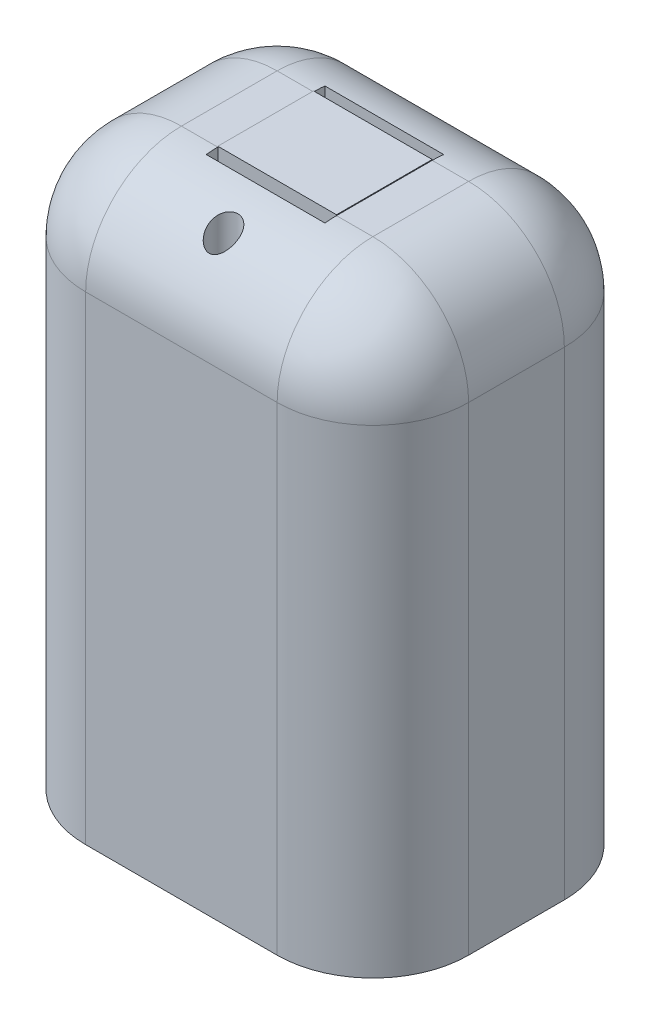
ISO-10303-21;
HEADER;
FILE_DESCRIPTION(('STEP AP214'),'2;1');
FILE_NAME('part.step','',(''),(''),'','','');
FILE_SCHEMA(('AUTOMOTIVE_DESIGN { 1 0 10303 214 1 1 1 1 }'));
ENDSEC;
DATA;
#1=APPLICATION_CONTEXT('core data for automotive mechanical design processes');
#2=APPLICATION_PROTOCOL_DEFINITION('international standard','automotive_design',2000,#1);
#3=PRODUCT_CONTEXT('',#1,'mechanical');
#4=PRODUCT('Part','Part','',(#3));
#5=PRODUCT_RELATED_PRODUCT_CATEGORY('part','',(#4));
#6=PRODUCT_DEFINITION_FORMATION('','',#4);
#7=PRODUCT_DEFINITION_CONTEXT('part definition',#1,'design');
#8=PRODUCT_DEFINITION('design','',#6,#7);
#9=PRODUCT_DEFINITION_SHAPE('','',#8);
#10=(LENGTH_UNIT() NAMED_UNIT(*) SI_UNIT(.MILLI.,.METRE.));
#11=(NAMED_UNIT(*) PLANE_ANGLE_UNIT() SI_UNIT($,.RADIAN.));
#12=(NAMED_UNIT(*) SI_UNIT($,.STERADIAN.) SOLID_ANGLE_UNIT());
#13=UNCERTAINTY_MEASURE_WITH_UNIT(LENGTH_MEASURE(1.E-05),#10,'distance_accuracy_value','');
#14=(GEOMETRIC_REPRESENTATION_CONTEXT(3) GLOBAL_UNCERTAINTY_ASSIGNED_CONTEXT((#13)) GLOBAL_UNIT_ASSIGNED_CONTEXT((#10,
#11,#12)) REPRESENTATION_CONTEXT('',''));
#15=CARTESIAN_POINT('',(0.,0.,0.));
#16=DIRECTION('',(0.,0.,1.));
#17=DIRECTION('',(1.,0.,0.));
#18=AXIS2_PLACEMENT_3D('',#15,#16,#17);
#19=CARTESIAN_POINT('',(-33.1654955272789,108.658164147272,4.4));
#20=DIRECTION('',(1.,0.,0.));
#21=DIRECTION('',(0.,0.,-1.));
#22=AXIS2_PLACEMENT_3D('',#19,#20,#21);
#23=PLANE('',#22);
#24=DIRECTION('',(0.,-1.,0.));
#25=VECTOR('',#24,1.);
#26=CARTESIAN_POINT('',(-33.1654955272789,135.449726458498,10.));
#27=LINE('',#26,#25);
#28=CARTESIAN_POINT('',(-33.1654955272789,135.408164147272,10.));
#29=VERTEX_POINT('',#28);
#30=CARTESIAN_POINT('',(-33.1654955272789,134.449726458498,10.));
#31=VERTEX_POINT('',#30);
#32=EDGE_CURVE('E56',#29,#31,#27,.T.);
#33=ORIENTED_EDGE('',*,*,#32,.T.);
#34=DIRECTION('',(0.,0.,-1.));
#35=VECTOR('',#34,1.);
#36=CARTESIAN_POINT('',(-33.1654955272789,134.449726458498,10.));
#37=LINE('',#36,#35);
#38=CARTESIAN_POINT('',(-33.1654955272789,134.449726458498,5.));
#39=VERTEX_POINT('',#38);
#40=EDGE_CURVE('E175',#31,#39,#37,.T.);
#41=ORIENTED_EDGE('',*,*,#40,.T.);
#42=DIRECTION('',(0.,1.,0.));
#43=VECTOR('',#42,1.);
#44=CARTESIAN_POINT('',(-33.1654955272789,135.449726458498,5.));
#45=LINE('',#44,#43);
#46=CARTESIAN_POINT('',(-33.1654955272789,135.408164147272,5.));
#47=VERTEX_POINT('',#46);
#48=EDGE_CURVE('E179',#39,#47,#45,.T.);
#49=ORIENTED_EDGE('',*,*,#48,.T.);
#50=CARTESIAN_POINT('',(-33.1654955272789,130.408164147272,5.));
#51=DIRECTION('',(1.,0.,0.));
#52=DIRECTION('',(0.,0.,-1.));
#53=AXIS2_PLACEMENT_3D('',#50,#51,#52);
#54=CIRCLE('',#53,5.);
#55=CARTESIAN_POINT('',(-33.1654955272789,135.372033605669,4.4));
#56=VERTEX_POINT('',#55);
#57=EDGE_CURVE('E345',#47,#56,#54,.F.);
#58=ORIENTED_EDGE('',*,*,#57,.T.);
#59=DIRECTION('',(0.,-1.,0.));
#60=VECTOR('',#59,1.);
#61=CARTESIAN_POINT('',(-33.1654955272789,108.658164147272,4.4));
#62=LINE('',#61,#60);
#63=CARTESIAN_POINT('',(-33.1654955272789,105.408164147272,4.4));
#64=VERTEX_POINT('',#63);
#65=EDGE_CURVE('E244',#56,#64,#62,.T.);
#66=ORIENTED_EDGE('',*,*,#65,.T.);
#67=DIRECTION('',(0.,0.,1.));
#68=VECTOR('',#67,1.);
#69=CARTESIAN_POINT('',(-33.1654955272789,105.408164147272,4.4));
#70=LINE('',#69,#68);
#71=CARTESIAN_POINT('',(-33.1654955272789,105.408164147272,10.6));
#72=VERTEX_POINT('',#71);
#73=EDGE_CURVE('E231',#64,#72,#70,.T.);
#74=ORIENTED_EDGE('',*,*,#73,.T.);
#75=DIRECTION('',(0.,-1.,0.));
#76=VECTOR('',#75,1.);
#77=CARTESIAN_POINT('',(-33.1654955272789,108.658164147272,10.6));
#78=LINE('',#77,#76);
#79=CARTESIAN_POINT('',(-33.1654955272789,135.372033605669,10.6));
#80=VERTEX_POINT('',#79);
#81=EDGE_CURVE('E243',#80,#72,#78,.T.);
#82=ORIENTED_EDGE('',*,*,#81,.F.);
#83=CARTESIAN_POINT('',(-33.1654955272789,130.408164147272,10.));
#84=DIRECTION('',(1.,0.,0.));
#85=DIRECTION('',(0.,0.,-1.));
#86=AXIS2_PLACEMENT_3D('',#83,#84,#85);
#87=CIRCLE('',#86,5.);
#88=EDGE_CURVE('E222',#80,#29,#87,.F.);
#89=ORIENTED_EDGE('',*,*,#88,.T.);
#90=EDGE_LOOP('',(#33,#41,#49,#58,#66,#74,#82,#89));
#91=FACE_BOUND('',#90,.T.);
#92=ADVANCED_FACE('F35',(#91),#23,.F.);
#93=CARTESIAN_POINT('',(-39.3654955272789,108.658164147272,4.4));
#94=DIRECTION('',(-1.,0.,0.));
#95=DIRECTION('',(0.,0.,1.));
#96=AXIS2_PLACEMENT_3D('',#93,#94,#95);
#97=PLANE('',#96);
#98=DIRECTION('',(0.,-1.,0.));
#99=VECTOR('',#98,1.);
#100=CARTESIAN_POINT('',(-39.3654955272789,135.449726458498,10.));
#101=LINE('',#100,#99);
#102=CARTESIAN_POINT('',(-39.3654955272789,135.408164147272,10.));
#103=VERTEX_POINT('',#102);
#104=CARTESIAN_POINT('',(-39.3654955272789,134.449726458498,10.));
#105=VERTEX_POINT('',#104);
#106=EDGE_CURVE('E207',#103,#105,#101,.T.);
#107=ORIENTED_EDGE('',*,*,#106,.F.);
#108=CARTESIAN_POINT('',(-39.3654955272789,130.408164147272,10.));
#109=DIRECTION('',(-1.,0.,0.));
#110=DIRECTION('',(0.,0.,1.));
#111=AXIS2_PLACEMENT_3D('',#108,#109,#110);
#112=CIRCLE('',#111,5.);
#113=CARTESIAN_POINT('',(-39.3654955272789,135.372033605669,10.6));
#114=VERTEX_POINT('',#113);
#115=EDGE_CURVE('E227',#103,#114,#112,.F.);
#116=ORIENTED_EDGE('',*,*,#115,.T.);
#117=DIRECTION('',(0.,-1.,0.));
#118=VECTOR('',#117,1.);
#119=CARTESIAN_POINT('',(-39.3654955272789,108.658164147272,10.6));
#120=LINE('',#119,#118);
#121=CARTESIAN_POINT('',(-39.3654955272789,105.408164147272,10.6));
#122=VERTEX_POINT('',#121);
#123=EDGE_CURVE('E249',#114,#122,#120,.T.);
#124=ORIENTED_EDGE('',*,*,#123,.T.);
#125=DIRECTION('',(0.,0.,-1.));
#126=VECTOR('',#125,1.);
#127=CARTESIAN_POINT('',(-39.3654955272789,105.408164147272,4.4));
#128=LINE('',#127,#126);
#129=CARTESIAN_POINT('',(-39.3654955272789,105.408164147272,4.4));
#130=VERTEX_POINT('',#129);
#131=EDGE_CURVE('E237',#122,#130,#128,.T.);
#132=ORIENTED_EDGE('',*,*,#131,.T.);
#133=DIRECTION('',(0.,-1.,0.));
#134=VECTOR('',#133,1.);
#135=CARTESIAN_POINT('',(-39.3654955272789,108.658164147272,4.4));
#136=LINE('',#135,#134);
#137=CARTESIAN_POINT('',(-39.3654955272789,135.372033605669,4.4));
#138=VERTEX_POINT('',#137);
#139=EDGE_CURVE('E247',#138,#130,#136,.T.);
#140=ORIENTED_EDGE('',*,*,#139,.F.);
#141=CARTESIAN_POINT('',(-39.3654955272789,130.408164147272,5.));
#142=DIRECTION('',(-1.,0.,0.));
#143=DIRECTION('',(0.,0.,1.));
#144=AXIS2_PLACEMENT_3D('',#141,#142,#143);
#145=CIRCLE('',#144,5.);
#146=CARTESIAN_POINT('',(-39.3654955272789,135.408164147272,5.));
#147=VERTEX_POINT('',#146);
#148=EDGE_CURVE('E49',#138,#147,#145,.F.);
#149=ORIENTED_EDGE('',*,*,#148,.T.);
#150=DIRECTION('',(0.,1.,0.));
#151=VECTOR('',#150,1.);
#152=CARTESIAN_POINT('',(-39.3654955272789,135.449726458498,5.));
#153=LINE('',#152,#151);
#154=CARTESIAN_POINT('',(-39.3654955272789,134.449726458498,5.));
#155=VERTEX_POINT('',#154);
#156=EDGE_CURVE('E210',#155,#147,#153,.T.);
#157=ORIENTED_EDGE('',*,*,#156,.F.);
#158=DIRECTION('',(0.,0.,-1.));
#159=VECTOR('',#158,1.);
#160=CARTESIAN_POINT('',(-39.3654955272789,134.449726458498,10.));
#161=LINE('',#160,#159);
#162=EDGE_CURVE('E64',#105,#155,#161,.T.);
#163=ORIENTED_EDGE('',*,*,#162,.F.);
#164=EDGE_LOOP('',(#107,#116,#124,#132,#140,#149,#157,#163));
#165=FACE_BOUND('',#164,.T.);
#166=ADVANCED_FACE('F350',(#165),#97,.F.);
#167=CARTESIAN_POINT('',(-46.2654955272789,135.408164147272,15.));
#168=DIRECTION('',(0.,-1.,0.));
#169=DIRECTION('',(0.,0.,-1.));
#170=AXIS2_PLACEMENT_3D('',#167,#168,#169);
#171=PLANE('',#170);
#172=DIRECTION('',(-1.,0.,0.));
#173=VECTOR('',#172,1.);
#174=CARTESIAN_POINT('',(-26.2654955272789,135.408164147272,10.));
#175=LINE('',#174,#173);
#176=CARTESIAN_POINT('',(-41.2654955272789,135.408164147272,10.));
#177=VERTEX_POINT('',#176);
#178=EDGE_CURVE('E271',#177,#103,#175,.F.);
#179=ORIENTED_EDGE('',*,*,#178,.T.);
#180=DIRECTION('',(0.,0.,-1.));
#181=VECTOR('',#180,1.);
#182=CARTESIAN_POINT('',(-39.3654955272789,135.408164147272,15.));
#183=LINE('',#182,#181);
#184=EDGE_CURVE('E224',#103,#147,#183,.T.);
#185=ORIENTED_EDGE('',*,*,#184,.T.);
#186=DIRECTION('',(-1.,0.,0.));
#187=VECTOR('',#186,1.);
#188=CARTESIAN_POINT('',(-46.2654955272789,135.408164147272,5.));
#189=LINE('',#188,#187);
#190=CARTESIAN_POINT('',(-41.2654955272789,135.408164147272,5.));
#191=VERTEX_POINT('',#190);
#192=EDGE_CURVE('E264',#147,#191,#189,.T.);
#193=ORIENTED_EDGE('',*,*,#192,.T.);
#194=DIRECTION('',(0.,0.,-1.));
#195=VECTOR('',#194,1.);
#196=CARTESIAN_POINT('',(-41.2654955272789,135.408164147272,15.));
#197=LINE('',#196,#195);
#198=EDGE_CURVE('E268',#191,#177,#197,.F.);
#199=ORIENTED_EDGE('',*,*,#198,.T.);
#200=EDGE_LOOP('',(#179,#185,#193,#199));
#201=FACE_BOUND('',#200,.T.);
#202=ADVANCED_FACE('F391',(#201),#171,.F.);
#203=CARTESIAN_POINT('',(-26.2654955272789,135.408164147272,15.));
#204=DIRECTION('',(-1.,0.,0.));
#205=DIRECTION('',(0.,-1.,0.));
#206=AXIS2_PLACEMENT_3D('',#203,#204,#205);
#207=PLANE('',#206);
#208=DIRECTION('',(0.,0.,-1.));
#209=VECTOR('',#208,1.);
#210=CARTESIAN_POINT('',(-26.2654955272789,105.408164147272,15.));
#211=LINE('',#210,#209);
#212=CARTESIAN_POINT('',(-26.2654955272789,105.408164147272,10.));
#213=VERTEX_POINT('',#212);
#214=CARTESIAN_POINT('',(-26.2654955272789,105.408164147272,5.));
#215=VERTEX_POINT('',#214);
#216=EDGE_CURVE('E256',#213,#215,#211,.T.);
#217=ORIENTED_EDGE('',*,*,#216,.T.);
#218=DIRECTION('',(0.,1.,0.));
#219=VECTOR('',#218,1.);
#220=CARTESIAN_POINT('',(-26.2654955272789,135.408164147272,5.));
#221=LINE('',#220,#219);
#222=CARTESIAN_POINT('',(-26.2654955272789,130.408164147272,5.));
#223=VERTEX_POINT('',#222);
#224=EDGE_CURVE('E282',#215,#223,#221,.T.);
#225=ORIENTED_EDGE('',*,*,#224,.T.);
#226=DIRECTION('',(0.,0.,-1.));
#227=VECTOR('',#226,1.);
#228=CARTESIAN_POINT('',(-26.2654955272789,130.408164147272,15.));
#229=LINE('',#228,#227);
#230=CARTESIAN_POINT('',(-26.2654955272789,130.408164147272,10.));
#231=VERTEX_POINT('',#230);
#232=EDGE_CURVE('E279',#223,#231,#229,.F.);
#233=ORIENTED_EDGE('',*,*,#232,.T.);
#234=DIRECTION('',(0.,1.,0.));
#235=VECTOR('',#234,1.);
#236=CARTESIAN_POINT('',(-26.2654955272789,105.408164147272,10.));
#237=LINE('',#236,#235);
#238=EDGE_CURVE('E277',#231,#213,#237,.F.);
#239=ORIENTED_EDGE('',*,*,#238,.T.);
#240=EDGE_LOOP('',(#217,#225,#233,#239));
#241=FACE_BOUND('',#240,.T.);
#242=ADVANCED_FACE('F465',(#241),#207,.F.);
#243=CARTESIAN_POINT('',(-31.2654955272789,135.408164147272,5.));
#244=VERTEX_POINT('',#243);
#245=EDGE_CURVE('E265',#244,#47,#189,.T.);
#246=ORIENTED_EDGE('',*,*,#245,.T.);
#247=DIRECTION('',(0.,0.,1.));
#248=VECTOR('',#247,1.);
#249=CARTESIAN_POINT('',(-33.1654955272789,135.408164147272,15.));
#250=LINE('',#249,#248);
#251=EDGE_CURVE('E219',#47,#29,#250,.T.);
#252=ORIENTED_EDGE('',*,*,#251,.T.);
#253=CARTESIAN_POINT('',(-31.2654955272789,135.408164147272,10.));
#254=VERTEX_POINT('',#253);
#255=EDGE_CURVE('E270',#29,#254,#175,.F.);
#256=ORIENTED_EDGE('',*,*,#255,.T.);
#257=DIRECTION('',(0.,0.,-1.));
#258=VECTOR('',#257,1.);
#259=CARTESIAN_POINT('',(-31.2654955272789,135.408164147272,15.));
#260=LINE('',#259,#258);
#261=EDGE_CURVE('E274',#254,#244,#260,.T.);
#262=ORIENTED_EDGE('',*,*,#261,.T.);
#263=EDGE_LOOP('',(#246,#252,#256,#262));
#264=FACE_BOUND('',#263,.T.);
#265=ADVANCED_FACE('F369',(#264),#171,.F.);
#266=CARTESIAN_POINT('',(-46.2654955272789,135.408164147272,15.));
#267=DIRECTION('',(1.,0.,0.));
#268=DIRECTION('',(0.,0.,-1.));
#269=AXIS2_PLACEMENT_3D('',#266,#267,#268);
#270=PLANE('',#269);
#271=DIRECTION('',(0.,0.,-1.));
#272=VECTOR('',#271,1.);
#273=CARTESIAN_POINT('',(-46.2654955272789,130.408164147272,15.));
#274=LINE('',#273,#272);
#275=CARTESIAN_POINT('',(-46.2654955272789,130.408164147272,10.));
#276=VERTEX_POINT('',#275);
#277=CARTESIAN_POINT('',(-46.2654955272789,130.408164147272,5.));
#278=VERTEX_POINT('',#277);
#279=EDGE_CURVE('E292',#276,#278,#274,.T.);
#280=ORIENTED_EDGE('',*,*,#279,.T.);
#281=DIRECTION('',(0.,-1.,0.));
#282=VECTOR('',#281,1.);
#283=CARTESIAN_POINT('',(-46.2654955272789,135.408164147272,5.));
#284=LINE('',#283,#282);
#285=CARTESIAN_POINT('',(-46.2654955272789,105.408164147272,5.));
#286=VERTEX_POINT('',#285);
#287=EDGE_CURVE('E294',#278,#286,#284,.T.);
#288=ORIENTED_EDGE('',*,*,#287,.T.);
#289=DIRECTION('',(0.,0.,-1.));
#290=VECTOR('',#289,1.);
#291=CARTESIAN_POINT('',(-46.2654955272789,105.408164147272,15.));
#292=LINE('',#291,#290);
#293=CARTESIAN_POINT('',(-46.2654955272789,105.408164147272,10.));
#294=VERTEX_POINT('',#293);
#295=EDGE_CURVE('E261',#294,#286,#292,.T.);
#296=ORIENTED_EDGE('',*,*,#295,.F.);
#297=DIRECTION('',(0.,-1.,0.));
#298=VECTOR('',#297,1.);
#299=CARTESIAN_POINT('',(-46.2654955272789,135.408164147272,10.));
#300=LINE('',#299,#298);
#301=EDGE_CURVE('E290',#294,#276,#300,.F.);
#302=ORIENTED_EDGE('',*,*,#301,.T.);
#303=EDGE_LOOP('',(#280,#288,#296,#302));
#304=FACE_BOUND('',#303,.T.);
#305=ADVANCED_FACE('F458',(#304),#270,.F.);
#306=CARTESIAN_POINT('',(-46.2654955272789,105.408164147272,15.));
#307=DIRECTION('',(0.,1.,0.));
#308=DIRECTION('',(0.,0.,1.));
#309=AXIS2_PLACEMENT_3D('',#306,#307,#308);
#310=PLANE('',#309);
#311=CARTESIAN_POINT('',(-36.2654955272789,105.408164147272,12.8));
#312=DIRECTION('',(0.,-1.,0.));
#313=DIRECTION('',(0.,0.,-1.));
#314=AXIS2_PLACEMENT_3D('',#311,#312,#313);
#315=CIRCLE('',#314,0.749999999999999);
#316=CARTESIAN_POINT('',(-36.2654955272789,105.408164147272,12.05));
#317=VERTEX_POINT('',#316);
#318=EDGE_CURVE('E382',#317,#317,#315,.T.);
#319=ORIENTED_EDGE('',*,*,#318,.F.);
#320=EDGE_LOOP('',(#319));
#321=FACE_BOUND('',#320,.T.);
#322=DIRECTION('',(-1.,0.,0.));
#323=VECTOR('',#322,1.);
#324=CARTESIAN_POINT('',(-39.3654955272789,105.408164147272,10.6));
#325=LINE('',#324,#323);
#326=EDGE_CURVE('E233',#72,#122,#325,.T.);
#327=ORIENTED_EDGE('',*,*,#326,.F.);
#328=ORIENTED_EDGE('',*,*,#73,.F.);
#329=DIRECTION('',(1.,0.,0.));
#330=VECTOR('',#329,1.);
#331=CARTESIAN_POINT('',(-39.3654955272789,105.408164147272,4.4));
#332=LINE('',#331,#330);
#333=EDGE_CURVE('E240',#130,#64,#332,.T.);
#334=ORIENTED_EDGE('',*,*,#333,.F.);
#335=ORIENTED_EDGE('',*,*,#131,.F.);
#336=EDGE_LOOP('',(#327,#328,#334,#335));
#337=FACE_BOUND('',#336,.T.);
#338=ORIENTED_EDGE('',*,*,#295,.T.);
#339=CARTESIAN_POINT('',(-41.2654955272789,105.408164147272,5.));
#340=DIRECTION('',(0.,1.,0.));
#341=DIRECTION('',(0.,0.,1.));
#342=AXIS2_PLACEMENT_3D('',#339,#340,#341);
#343=CIRCLE('',#342,5.);
#344=CARTESIAN_POINT('',(-41.2654955272789,105.408164147272,0.));
#345=VERTEX_POINT('',#344);
#346=EDGE_CURVE('E308',#286,#345,#343,.F.);
#347=ORIENTED_EDGE('',*,*,#346,.T.);
#348=DIRECTION('',(1.,0.,0.));
#349=VECTOR('',#348,1.);
#350=CARTESIAN_POINT('',(-46.2654955272789,105.408164147272,0.));
#351=LINE('',#350,#349);
#352=CARTESIAN_POINT('',(-31.2654955272789,105.408164147272,0.));
#353=VERTEX_POINT('',#352);
#354=EDGE_CURVE('E246',#345,#353,#351,.T.);
#355=ORIENTED_EDGE('',*,*,#354,.T.);
#356=CARTESIAN_POINT('',(-31.2654955272789,105.408164147272,5.));
#357=DIRECTION('',(0.,1.,0.));
#358=DIRECTION('',(0.,0.,1.));
#359=AXIS2_PLACEMENT_3D('',#356,#357,#358);
#360=CIRCLE('',#359,5.);
#361=EDGE_CURVE('E304',#353,#215,#360,.F.);
#362=ORIENTED_EDGE('',*,*,#361,.T.);
#363=ORIENTED_EDGE('',*,*,#216,.F.);
#364=CARTESIAN_POINT('',(-31.2654955272789,105.408164147272,10.));
#365=DIRECTION('',(0.,1.,0.));
#366=DIRECTION('',(0.,0.,1.));
#367=AXIS2_PLACEMENT_3D('',#364,#365,#366);
#368=CIRCLE('',#367,5.);
#369=CARTESIAN_POINT('',(-31.2654955272789,105.408164147272,15.));
#370=VERTEX_POINT('',#369);
#371=EDGE_CURVE('E302',#213,#370,#368,.F.);
#372=ORIENTED_EDGE('',*,*,#371,.T.);
#373=DIRECTION('',(1.,0.,0.));
#374=VECTOR('',#373,1.);
#375=CARTESIAN_POINT('',(-46.2654955272789,105.408164147272,15.));
#376=LINE('',#375,#374);
#377=CARTESIAN_POINT('',(-41.2654955272789,105.408164147272,15.));
#378=VERTEX_POINT('',#377);
#379=EDGE_CURVE('E253',#378,#370,#376,.T.);
#380=ORIENTED_EDGE('',*,*,#379,.F.);
#381=CARTESIAN_POINT('',(-41.2654955272789,105.408164147272,10.));
#382=DIRECTION('',(0.,1.,0.));
#383=DIRECTION('',(0.,0.,1.));
#384=AXIS2_PLACEMENT_3D('',#381,#382,#383);
#385=CIRCLE('',#384,5.);
#386=EDGE_CURVE('E306',#378,#294,#385,.F.);
#387=ORIENTED_EDGE('',*,*,#386,.T.);
#388=EDGE_LOOP('',(#338,#347,#355,#362,#363,#372,#380,#387));
#389=FACE_BOUND('',#388,.T.);
#390=ADVANCED_FACE('F430',(#321,#337,#389),#310,.F.);
#391=CARTESIAN_POINT('',(0.,0.,15.));
#392=DIRECTION('',(0.,0.,1.));
#393=DIRECTION('',(1.,0.,0.));
#394=AXIS2_PLACEMENT_3D('',#391,#392,#393);
#395=PLANE('',#394);
#396=DIRECTION('',(-1.,0.,0.));
#397=VECTOR('',#396,1.);
#398=CARTESIAN_POINT('',(-46.2654955272789,130.408164147272,15.));
#399=LINE('',#398,#397);
#400=CARTESIAN_POINT('',(-31.2654955272789,130.408164147272,15.));
#401=VERTEX_POINT('',#400);
#402=CARTESIAN_POINT('',(-41.2654955272789,130.408164147272,15.));
#403=VERTEX_POINT('',#402);
#404=EDGE_CURVE('E286',#401,#403,#399,.T.);
#405=ORIENTED_EDGE('',*,*,#404,.T.);
#406=DIRECTION('',(0.,-1.,0.));
#407=VECTOR('',#406,1.);
#408=CARTESIAN_POINT('',(-41.2654955272789,105.408164147272,15.));
#409=LINE('',#408,#407);
#410=EDGE_CURVE('E288',#403,#378,#409,.T.);
#411=ORIENTED_EDGE('',*,*,#410,.T.);
#412=ORIENTED_EDGE('',*,*,#379,.T.);
#413=DIRECTION('',(0.,1.,0.));
#414=VECTOR('',#413,1.);
#415=CARTESIAN_POINT('',(-31.2654955272789,135.408164147272,15.));
#416=LINE('',#415,#414);
#417=EDGE_CURVE('E284',#370,#401,#416,.T.);
#418=ORIENTED_EDGE('',*,*,#417,.T.);
#419=EDGE_LOOP('',(#405,#411,#412,#418));
#420=FACE_BOUND('',#419,.T.);
#421=ADVANCED_FACE('F450',(#420),#395,.T.);
#422=CARTESIAN_POINT('',(0.,0.,0.));
#423=DIRECTION('',(0.,0.,1.));
#424=DIRECTION('',(1.,0.,0.));
#425=AXIS2_PLACEMENT_3D('',#422,#423,#424);
#426=PLANE('',#425);
#427=ORIENTED_EDGE('',*,*,#354,.F.);
#428=DIRECTION('',(0.,-1.,0.));
#429=VECTOR('',#428,1.);
#430=CARTESIAN_POINT('',(-41.2654955272789,0.,0.));
#431=LINE('',#430,#429);
#432=CARTESIAN_POINT('',(-41.2654955272789,130.408164147272,0.));
#433=VERTEX_POINT('',#432);
#434=EDGE_CURVE('E300',#345,#433,#431,.F.);
#435=ORIENTED_EDGE('',*,*,#434,.T.);
#436=DIRECTION('',(-1.,0.,0.));
#437=VECTOR('',#436,1.);
#438=CARTESIAN_POINT('',(0.,130.408164147272,0.));
#439=LINE('',#438,#437);
#440=CARTESIAN_POINT('',(-31.2654955272789,130.408164147272,0.));
#441=VERTEX_POINT('',#440);
#442=EDGE_CURVE('E298',#433,#441,#439,.F.);
#443=ORIENTED_EDGE('',*,*,#442,.T.);
#444=DIRECTION('',(0.,1.,0.));
#445=VECTOR('',#444,1.);
#446=CARTESIAN_POINT('',(-31.2654955272788,0.,0.));
#447=LINE('',#446,#445);
#448=EDGE_CURVE('E296',#441,#353,#447,.F.);
#449=ORIENTED_EDGE('',*,*,#448,.T.);
#450=EDGE_LOOP('',(#427,#435,#443,#449));
#451=FACE_BOUND('',#450,.T.);
#452=ADVANCED_FACE('F441',(#451),#426,.F.);
#453=CARTESIAN_POINT('',(-39.3654955272789,108.658164147272,4.4));
#454=DIRECTION('',(0.,0.,-1.));
#455=DIRECTION('',(-1.,0.,0.));
#456=AXIS2_PLACEMENT_3D('',#453,#454,#455);
#457=PLANE('',#456);
#458=ORIENTED_EDGE('',*,*,#333,.T.);
#459=ORIENTED_EDGE('',*,*,#65,.F.);
#460=DIRECTION('',(-1.,0.,0.));
#461=VECTOR('',#460,1.);
#462=CARTESIAN_POINT('',(-46.2654955272789,135.372033605669,4.4));
#463=LINE('',#462,#461);
#464=EDGE_CURVE('E310',#56,#138,#463,.T.);
#465=ORIENTED_EDGE('',*,*,#464,.T.);
#466=ORIENTED_EDGE('',*,*,#139,.T.);
#467=EDGE_LOOP('',(#458,#459,#465,#466));
#468=FACE_BOUND('',#467,.T.);
#469=ADVANCED_FACE('F426',(#468),#457,.F.);
#470=CARTESIAN_POINT('',(-39.3654955272789,108.658164147272,10.6));
#471=DIRECTION('',(0.,0.,1.));
#472=DIRECTION('',(1.,0.,0.));
#473=AXIS2_PLACEMENT_3D('',#470,#471,#472);
#474=PLANE('',#473);
#475=ORIENTED_EDGE('',*,*,#326,.T.);
#476=ORIENTED_EDGE('',*,*,#123,.F.);
#477=DIRECTION('',(1.,0.,0.));
#478=VECTOR('',#477,1.);
#479=CARTESIAN_POINT('',(0.,135.372033605669,10.6));
#480=LINE('',#479,#478);
#481=EDGE_CURVE('E11',#114,#80,#480,.T.);
#482=ORIENTED_EDGE('',*,*,#481,.T.);
#483=ORIENTED_EDGE('',*,*,#81,.T.);
#484=EDGE_LOOP('',(#475,#476,#482,#483));
#485=FACE_BOUND('',#484,.T.);
#486=ADVANCED_FACE('F433',(#485),#474,.F.);
#487=CARTESIAN_POINT('',(-41.2654955272789,0.,10.));
#488=DIRECTION('',(0.,1.,0.));
#489=DIRECTION('',(0.,0.,1.));
#490=AXIS2_PLACEMENT_3D('',#487,#488,#489);
#491=CYLINDRICAL_SURFACE('',#490,5.);
#492=ORIENTED_EDGE('',*,*,#386,.F.);
#493=ORIENTED_EDGE('',*,*,#410,.F.);
#494=CARTESIAN_POINT('',(-41.2654955272789,130.408164147272,10.));
#495=DIRECTION('',(0.,1.,0.));
#496=DIRECTION('',(0.,0.,1.));
#497=AXIS2_PLACEMENT_3D('',#494,#495,#496);
#498=CIRCLE('',#497,5.);
#499=EDGE_CURVE('E234',#276,#403,#498,.T.);
#500=ORIENTED_EDGE('',*,*,#499,.F.);
#501=ORIENTED_EDGE('',*,*,#301,.F.);
#502=EDGE_LOOP('',(#492,#493,#500,#501));
#503=FACE_BOUND('',#502,.T.);
#504=ADVANCED_FACE('F37',(#503),#491,.T.);
#505=CARTESIAN_POINT('',(-41.2654955272789,130.408164147272,15.));
#506=DIRECTION('',(0.,0.,-1.));
#507=DIRECTION('',(-1.,0.,0.));
#508=AXIS2_PLACEMENT_3D('',#505,#506,#507);
#509=CYLINDRICAL_SURFACE('',#508,5.);
#510=CARTESIAN_POINT('',(-41.2654955272789,130.408164147272,5.));
#511=DIRECTION('',(0.,0.,-1.));
#512=DIRECTION('',(-1.,0.,0.));
#513=AXIS2_PLACEMENT_3D('',#510,#511,#512);
#514=CIRCLE('',#513,5.);
#515=EDGE_CURVE('E335',#278,#191,#514,.T.);
#516=ORIENTED_EDGE('',*,*,#515,.F.);
#517=ORIENTED_EDGE('',*,*,#279,.F.);
#518=CARTESIAN_POINT('',(-41.2654955272789,130.408164147272,10.));
#519=DIRECTION('',(0.,0.,1.));
#520=DIRECTION('',(1.,0.,0.));
#521=AXIS2_PLACEMENT_3D('',#518,#519,#520);
#522=CIRCLE('',#521,5.);
#523=EDGE_CURVE('E338',#177,#276,#522,.T.);
#524=ORIENTED_EDGE('',*,*,#523,.F.);
#525=ORIENTED_EDGE('',*,*,#198,.F.);
#526=EDGE_LOOP('',(#516,#517,#524,#525));
#527=FACE_BOUND('',#526,.T.);
#528=ADVANCED_FACE('F398',(#527),#509,.T.);
#529=CARTESIAN_POINT('',(-41.2654955272789,135.408164147272,5.));
#530=DIRECTION('',(0.,-1.,0.));
#531=DIRECTION('',(0.,0.,-1.));
#532=AXIS2_PLACEMENT_3D('',#529,#530,#531);
#533=CYLINDRICAL_SURFACE('',#532,5.);
#534=ORIENTED_EDGE('',*,*,#346,.F.);
#535=ORIENTED_EDGE('',*,*,#287,.F.);
#536=CARTESIAN_POINT('',(-41.2654955272789,130.408164147272,5.));
#537=DIRECTION('',(0.,1.,0.));
#538=DIRECTION('',(0.,0.,1.));
#539=AXIS2_PLACEMENT_3D('',#536,#537,#538);
#540=CIRCLE('',#539,5.);
#541=EDGE_CURVE('E332',#433,#278,#540,.T.);
#542=ORIENTED_EDGE('',*,*,#541,.F.);
#543=ORIENTED_EDGE('',*,*,#434,.F.);
#544=EDGE_LOOP('',(#534,#535,#542,#543));
#545=FACE_BOUND('',#544,.T.);
#546=ADVANCED_FACE('F492',(#545),#533,.T.);
#547=CARTESIAN_POINT('',(-41.2654955272789,130.408164147272,10.));
#548=DIRECTION('',(0.,0.,1.));
#549=DIRECTION('',(1.,0.,0.));
#550=AXIS2_PLACEMENT_3D('',#547,#548,#549);
#551=SPHERICAL_SURFACE('',#550,5.);
#552=ORIENTED_EDGE('',*,*,#523,.T.);
#553=ORIENTED_EDGE('',*,*,#499,.T.);
#554=CARTESIAN_POINT('',(-41.2654955272789,130.408164147272,10.));
#555=DIRECTION('',(-1.,0.,0.));
#556=DIRECTION('',(0.,0.,1.));
#557=AXIS2_PLACEMENT_3D('',#554,#555,#556);
#558=CIRCLE('',#557,5.);
#559=EDGE_CURVE('E329',#177,#403,#558,.F.);
#560=ORIENTED_EDGE('',*,*,#559,.F.);
#561=EDGE_LOOP('',(#552,#553,#560));
#562=FACE_BOUND('',#561,.T.);
#563=ADVANCED_FACE('F401',(#562),#551,.T.);
#564=CARTESIAN_POINT('',(-41.2654955272789,130.408164147272,5.));
#565=DIRECTION('',(0.,0.,1.));
#566=DIRECTION('',(1.,0.,0.));
#567=AXIS2_PLACEMENT_3D('',#564,#565,#566);
#568=SPHERICAL_SURFACE('',#567,5.);
#569=ORIENTED_EDGE('',*,*,#541,.T.);
#570=ORIENTED_EDGE('',*,*,#515,.T.);
#571=CARTESIAN_POINT('',(-41.2654955272789,130.408164147272,5.));
#572=DIRECTION('',(-1.,0.,0.));
#573=DIRECTION('',(0.,0.,1.));
#574=AXIS2_PLACEMENT_3D('',#571,#572,#573);
#575=CIRCLE('',#574,5.);
#576=EDGE_CURVE('E326',#433,#191,#575,.F.);
#577=ORIENTED_EDGE('',*,*,#576,.F.);
#578=EDGE_LOOP('',(#569,#570,#577));
#579=FACE_BOUND('',#578,.T.);
#580=ADVANCED_FACE('F486',(#579),#568,.T.);
#581=CARTESIAN_POINT('',(-31.2654955272788,0.,10.));
#582=DIRECTION('',(0.,-1.,0.));
#583=DIRECTION('',(1.,0.,0.));
#584=AXIS2_PLACEMENT_3D('',#581,#582,#583);
#585=CYLINDRICAL_SURFACE('',#584,5.);
#586=ORIENTED_EDGE('',*,*,#371,.F.);
#587=ORIENTED_EDGE('',*,*,#238,.F.);
#588=CARTESIAN_POINT('',(-31.2654955272789,130.408164147272,10.));
#589=DIRECTION('',(0.,1.,0.));
#590=DIRECTION('',(0.,0.,1.));
#591=AXIS2_PLACEMENT_3D('',#588,#589,#590);
#592=CIRCLE('',#591,5.);
#593=EDGE_CURVE('E323',#401,#231,#592,.T.);
#594=ORIENTED_EDGE('',*,*,#593,.F.);
#595=ORIENTED_EDGE('',*,*,#417,.F.);
#596=EDGE_LOOP('',(#586,#587,#594,#595));
#597=FACE_BOUND('',#596,.T.);
#598=ADVANCED_FACE('F409',(#597),#585,.T.);
#599=CARTESIAN_POINT('',(0.,130.408164147272,10.));
#600=DIRECTION('',(1.,0.,0.));
#601=DIRECTION('',(0.,0.,-1.));
#602=AXIS2_PLACEMENT_3D('',#599,#600,#601);
#603=CYLINDRICAL_SURFACE('',#602,5.);
#604=CARTESIAN_POINT('',(-36.2654955272789,134.968591758802,12.05));
#605=CARTESIAN_POINT('',(-36.3046582947614,134.968592014172,12.0499990569862));
#606=CARTESIAN_POINT('',(-36.3438149871375,134.967211780495,12.0530781208514));
#607=CARTESIAN_POINT('',(-36.4209759415768,134.961708612389,12.0652547036209));
#608=CARTESIAN_POINT('',(-36.4589803908768,134.957586126095,12.0743512391587));
#609=CARTESIAN_POINT('',(-36.5327232490328,134.946657644473,12.0981530813883));
#610=CARTESIAN_POINT('',(-36.5684643119055,134.939854862283,12.1128516716518));
#611=CARTESIAN_POINT('',(-36.636810385859,134.923659645896,12.1472447614362));
#612=CARTESIAN_POINT('',(-36.6694150957388,134.914266963311,12.1669397401281));
#613=CARTESIAN_POINT('',(-36.7315494253937,134.892757957929,12.2111162722663));
#614=CARTESIAN_POINT('',(-36.7609783614992,134.880577785346,12.2357079266712));
#615=CARTESIAN_POINT('',(-36.8152305062295,134.853841472147,12.2884111674201));
#616=CARTESIAN_POINT('',(-36.8400526626046,134.839284790127,12.3165235554967));
#617=CARTESIAN_POINT('',(-36.8865646244883,134.806797710998,12.3776693680097));
#618=CARTESIAN_POINT('',(-36.9078498325862,134.78869130155,12.4109162532227));
#619=CARTESIAN_POINT('',(-36.944596840436,134.750338624774,12.4793267105801));
#620=CARTESIAN_POINT('',(-36.9600560420148,134.730091407872,12.5144911298874));
#621=CARTESIAN_POINT('',(-36.9867673823783,134.685264265351,12.5900903780493));
#622=CARTESIAN_POINT('',(-36.9972855010734,134.660456424108,12.6306486427861));
#623=CARTESIAN_POINT('',(-37.0114407294362,134.60912794067,12.7118659164591));
#624=CARTESIAN_POINT('',(-37.0150748020394,134.582606547832,12.7525249619404));
#625=CARTESIAN_POINT('',(-37.0159040953974,134.524362123606,12.8390161377746));
#626=CARTESIAN_POINT('',(-37.0120736521137,134.492447768101,12.8847295462977));
#627=CARTESIAN_POINT('',(-36.9964031188192,134.427776994455,12.9741834971981));
#628=CARTESIAN_POINT('',(-36.984554430391,134.395019708705,13.0179218678649));
#629=CARTESIAN_POINT('',(-36.9512791894348,134.325409210159,13.1078627176739));
#630=CARTESIAN_POINT('',(-36.9288432610343,134.288554162016,13.1536932727377));
#631=CARTESIAN_POINT('',(-36.8745507990904,134.216226434235,13.2406558900356));
#632=CARTESIAN_POINT('',(-36.8427004630719,134.180752862501,13.281791018662));
#633=CARTESIAN_POINT('',(-36.7794518032044,134.122352224378,13.3475647432093));
#634=CARTESIAN_POINT('',(-36.7502815958799,134.098634846575,13.3736489166772));
#635=CARTESIAN_POINT('',(-36.6868230161689,134.054086919819,13.4217414950831));
#636=CARTESIAN_POINT('',(-36.6525439167793,134.033251269768,13.4437571258086));
#637=CARTESIAN_POINT('',(-36.5875053612794,134.000265584677,13.4781086385032));
#638=CARTESIAN_POINT('',(-36.5577646579611,133.987221184818,13.4915056607535));
#639=CARTESIAN_POINT('',(-36.4956308463333,133.964559474956,13.5145859418448));
#640=CARTESIAN_POINT('',(-36.463239750962,133.95493959325,13.5242719879293));
#641=CARTESIAN_POINT('',(-36.3961696102525,133.939910820953,13.5393336541117));
#642=CARTESIAN_POINT('',(-36.361472421993,133.934541059617,13.5446692343308));
#643=CARTESIAN_POINT('',(-36.2912703062575,133.928790558811,13.5503814454866));
#644=CARTESIAN_POINT('',(-36.2557661008627,133.928405522632,13.5507623472361));
#645=CARTESIAN_POINT('',(-36.1903069112115,133.932356415149,13.5468397713735));
#646=CARTESIAN_POINT('',(-36.1602688860633,133.936041098317,13.5431825148088));
#647=CARTESIAN_POINT('',(-36.1014409982041,133.946788600565,13.5324487576088));
#648=CARTESIAN_POINT('',(-36.0726516929065,133.953852911682,13.5253707467648));
#649=CARTESIAN_POINT('',(-36.0093475836141,133.973141525835,13.5058764178663));
#650=CARTESIAN_POINT('',(-35.9753875590585,133.986244301505,13.4925344473002));
#651=CARTESIAN_POINT('',(-35.9109536942391,134.015915921253,13.4618756284575));
#652=CARTESIAN_POINT('',(-35.8804866020122,134.03249130516,13.4445512742423));
#653=CARTESIAN_POINT('',(-35.8133848831698,134.074217854882,13.4001855956357));
#654=CARTESIAN_POINT('',(-35.7782258288602,134.100359179722,13.3718505190239));
#655=CARTESIAN_POINT('',(-35.7144899973183,134.155262969051,13.3107318393157));
#656=CARTESIAN_POINT('',(-35.6859200359213,134.184028105113,13.2779436850963));
#657=CARTESIAN_POINT('',(-35.634649128855,134.243650636856,13.2079907501748));
#658=CARTESIAN_POINT('',(-35.6121059904909,134.27454172651,13.1707396251441));
#659=CARTESIAN_POINT('',(-35.5738596799162,134.336797979704,13.0932684441863));
#660=CARTESIAN_POINT('',(-35.5581566258835,134.368163151424,13.0530483369775));
#661=CARTESIAN_POINT('',(-35.5315052194321,134.436525941694,12.9624470548934));
#662=CARTESIAN_POINT('',(-35.5220185528753,134.473466463232,12.9115831411359));
#663=CARTESIAN_POINT('',(-35.5137335245183,134.545804602355,12.807833777852));
#664=CARTESIAN_POINT('',(-35.5149421750878,134.58120119238,12.7549470246788));
#665=CARTESIAN_POINT('',(-35.52873998778,134.648385001688,12.6503369124789));
#666=CARTESIAN_POINT('',(-35.5410220614271,134.680243711353,12.5986205390158));
#667=CARTESIAN_POINT('',(-35.5772370148989,134.740300240476,12.4972084410527));
#668=CARTESIAN_POINT('',(-35.6011435752658,134.768506148562,12.447508425345));
#669=CARTESIAN_POINT('',(-35.652268817802,134.81292952302,12.3663373821646));
#670=CARTESIAN_POINT('',(-35.6766449540281,134.830282956087,12.3336824392656));
#671=CARTESIAN_POINT('',(-35.7311957843953,134.862253333491,12.2720674055172));
#672=CARTESIAN_POINT('',(-35.7613673971712,134.87687172389,12.2431053647632));
#673=CARTESIAN_POINT('',(-35.8270840973099,134.903132499597,12.1900102320272));
#674=CARTESIAN_POINT('',(-35.8626518314883,134.914761757884,12.1658985381085));
#675=CARTESIAN_POINT('',(-35.9381142268057,134.934733125498,12.1238452062246));
#676=CARTESIAN_POINT('',(-35.9780082396273,134.943075726482,12.105902645456));
#677=CARTESIAN_POINT('',(-36.0585987512196,134.955968111979,12.077908880165));
#678=CARTESIAN_POINT('',(-36.0991376178152,134.960697226363,12.0674862413028));
#679=CARTESIAN_POINT('',(-36.181618812146,134.967008372267,12.0535334904867));
#680=CARTESIAN_POINT('',(-36.2235606525069,134.968591485355,12.0500010097643));
#681=CARTESIAN_POINT('',(-36.2654955272789,134.968591758802,12.05));
#682=B_SPLINE_CURVE_WITH_KNOTS('',3,(#604,#605,#606,#607,#608,#609,#610,#611,#612,#613,#614,
#615,#616,#617,#618,#619,#620,#621,#622,#623,#624,#625,#626,#627,#628,#629,#630,#631,#632,#633,
#634,#635,#636,#637,#638,#639,#640,#641,#642,#643,#644,#645,#646,#647,#648,#649,#650,#651,#652,
#653,#654,#655,#656,#657,#658,#659,#660,#661,#662,#663,#664,#665,#666,#667,#668,#669,#670,#671,
#672,#673,#674,#675,#676,#677,#678,#679,#680,#681),.UNSPECIFIED.,.T.,.F.,(4,2,2,2,2,2,2,2,2,2,2,
2,2,2,2,2,2,2,2,2,2,2,2,2,2,2,2,2,2,2,2,2,2,2,2,2,2,2,4),(0.,0.117334718224529,
0.234650266515585,0.351825602795281,0.469012180851056,0.589213382999954,0.709442007005459,
0.839206599392844,0.9690289934717,1.11453746894013,1.2601101240792,1.42709406170543,
1.59425734999546,1.78224733682189,1.97011384400973,2.10694027497256,2.243521314598,
2.34852306194831,2.45344578915439,2.55932361486696,2.66511017040587,2.7561357449278,
2.84720154255418,2.96287293371477,3.07876415462333,3.23445804024278,3.39031226224554,
3.54991762997039,3.70952575512527,3.89933143532011,4.08926157055881,4.27408128876523,
4.45848448424678,4.59080497635315,4.7230553094661,4.85587687297445,4.98867855985676,
5.11436194493683,5.24000211368525),.UNSPECIFIED.);
#683=CARTESIAN_POINT('',(-36.2654955272789,134.968591758802,12.05));
#684=VERTEX_POINT('',#683);
#685=EDGE_CURVE('E39',#684,#684,#682,.T.);
#686=ORIENTED_EDGE('',*,*,#685,.F.);
#687=EDGE_LOOP('',(#686));
#688=FACE_BOUND('',#687,.T.);
#689=ORIENTED_EDGE('',*,*,#115,.F.);
#690=ORIENTED_EDGE('',*,*,#178,.F.);
#691=ORIENTED_EDGE('',*,*,#559,.T.);
#692=ORIENTED_EDGE('',*,*,#404,.F.);
#693=CARTESIAN_POINT('',(-31.2654955272789,130.408164147272,10.));
#694=DIRECTION('',(1.,0.,0.));
#695=DIRECTION('',(0.,0.,-1.));
#696=AXIS2_PLACEMENT_3D('',#693,#694,#695);
#697=CIRCLE('',#696,5.);
#698=EDGE_CURVE('E320',#254,#401,#697,.T.);
#699=ORIENTED_EDGE('',*,*,#698,.F.);
#700=ORIENTED_EDGE('',*,*,#255,.F.);
#701=ORIENTED_EDGE('',*,*,#88,.F.);
#702=ORIENTED_EDGE('',*,*,#481,.F.);
#703=EDGE_LOOP('',(#689,#690,#691,#692,#699,#700,#701,#702));
#704=FACE_BOUND('',#703,.T.);
#705=ADVANCED_FACE('F375',(#688,#704),#603,.T.);
#706=CARTESIAN_POINT('',(-46.2654955272789,130.408164147272,5.));
#707=DIRECTION('',(-1.,0.,0.));
#708=DIRECTION('',(0.,0.,1.));
#709=AXIS2_PLACEMENT_3D('',#706,#707,#708);
#710=CYLINDRICAL_SURFACE('',#709,5.);
#711=ORIENTED_EDGE('',*,*,#148,.F.);
#712=ORIENTED_EDGE('',*,*,#464,.F.);
#713=ORIENTED_EDGE('',*,*,#57,.F.);
#714=ORIENTED_EDGE('',*,*,#245,.F.);
#715=CARTESIAN_POINT('',(-31.2654955272789,130.408164147272,5.));
#716=DIRECTION('',(1.,0.,0.));
#717=DIRECTION('',(0.,0.,-1.));
#718=AXIS2_PLACEMENT_3D('',#715,#716,#717);
#719=CIRCLE('',#718,5.);
#720=EDGE_CURVE('E317',#441,#244,#719,.T.);
#721=ORIENTED_EDGE('',*,*,#720,.F.);
#722=ORIENTED_EDGE('',*,*,#442,.F.);
#723=ORIENTED_EDGE('',*,*,#576,.T.);
#724=ORIENTED_EDGE('',*,*,#192,.F.);
#725=EDGE_LOOP('',(#711,#712,#713,#714,#721,#722,#723,#724));
#726=FACE_BOUND('',#725,.T.);
#727=ADVANCED_FACE('F422',(#726),#710,.T.);
#728=CARTESIAN_POINT('',(-31.2654955272789,135.408164147272,5.));
#729=DIRECTION('',(0.,1.,0.));
#730=DIRECTION('',(-1.,0.,0.));
#731=AXIS2_PLACEMENT_3D('',#728,#729,#730);
#732=CYLINDRICAL_SURFACE('',#731,5.);
#733=ORIENTED_EDGE('',*,*,#361,.F.);
#734=ORIENTED_EDGE('',*,*,#448,.F.);
#735=CARTESIAN_POINT('',(-31.2654955272789,130.408164147272,5.));
#736=DIRECTION('',(0.,1.,0.));
#737=DIRECTION('',(0.,0.,1.));
#738=AXIS2_PLACEMENT_3D('',#735,#736,#737);
#739=CIRCLE('',#738,5.);
#740=EDGE_CURVE('E314',#223,#441,#739,.T.);
#741=ORIENTED_EDGE('',*,*,#740,.F.);
#742=ORIENTED_EDGE('',*,*,#224,.F.);
#743=EDGE_LOOP('',(#733,#734,#741,#742));
#744=FACE_BOUND('',#743,.T.);
#745=ADVANCED_FACE('F475',(#744),#732,.T.);
#746=CARTESIAN_POINT('',(-31.2654955272789,130.408164147272,10.));
#747=DIRECTION('',(0.,0.,1.));
#748=DIRECTION('',(1.,0.,0.));
#749=AXIS2_PLACEMENT_3D('',#746,#747,#748);
#750=SPHERICAL_SURFACE('',#749,5.);
#751=ORIENTED_EDGE('',*,*,#698,.T.);
#752=ORIENTED_EDGE('',*,*,#593,.T.);
#753=CARTESIAN_POINT('',(-31.2654955272789,130.408164147272,10.));
#754=DIRECTION('',(0.,0.,1.));
#755=DIRECTION('',(1.,0.,0.));
#756=AXIS2_PLACEMENT_3D('',#753,#754,#755);
#757=CIRCLE('',#756,5.);
#758=EDGE_CURVE('E312',#254,#231,#757,.F.);
#759=ORIENTED_EDGE('',*,*,#758,.F.);
#760=EDGE_LOOP('',(#751,#752,#759));
#761=FACE_BOUND('',#760,.T.);
#762=ADVANCED_FACE('F411',(#761),#750,.T.);
#763=CARTESIAN_POINT('',(-31.2654955272789,130.408164147272,5.));
#764=DIRECTION('',(0.,0.,1.));
#765=DIRECTION('',(1.,0.,0.));
#766=AXIS2_PLACEMENT_3D('',#763,#764,#765);
#767=SPHERICAL_SURFACE('',#766,5.);
#768=ORIENTED_EDGE('',*,*,#740,.T.);
#769=ORIENTED_EDGE('',*,*,#720,.T.);
#770=CARTESIAN_POINT('',(-31.2654955272789,130.408164147272,5.));
#771=DIRECTION('',(0.,0.,-1.));
#772=DIRECTION('',(-1.,0.,0.));
#773=AXIS2_PLACEMENT_3D('',#770,#771,#772);
#774=CIRCLE('',#773,5.);
#775=EDGE_CURVE('E230',#223,#244,#774,.F.);
#776=ORIENTED_EDGE('',*,*,#775,.F.);
#777=EDGE_LOOP('',(#768,#769,#776));
#778=FACE_BOUND('',#777,.T.);
#779=ADVANCED_FACE('F419',(#778),#767,.T.);
#780=CARTESIAN_POINT('',(-31.2654955272789,130.408164147272,15.));
#781=DIRECTION('',(0.,0.,-1.));
#782=DIRECTION('',(-1.,0.,0.));
#783=AXIS2_PLACEMENT_3D('',#780,#781,#782);
#784=CYLINDRICAL_SURFACE('',#783,5.);
#785=ORIENTED_EDGE('',*,*,#758,.T.);
#786=ORIENTED_EDGE('',*,*,#232,.F.);
#787=ORIENTED_EDGE('',*,*,#775,.T.);
#788=ORIENTED_EDGE('',*,*,#261,.F.);
#789=EDGE_LOOP('',(#785,#786,#787,#788));
#790=FACE_BOUND('',#789,.T.);
#791=ADVANCED_FACE('F415',(#790),#784,.T.);
#792=CARTESIAN_POINT('',(-33.1654955272789,0.,0.));
#793=DIRECTION('',(1.,0.,0.));
#794=DIRECTION('',(0.,0.,-1.));
#795=AXIS2_PLACEMENT_3D('',#792,#793,#794);
#796=PLANE('',#795);
#797=ORIENTED_EDGE('',*,*,#251,.F.);
#798=CARTESIAN_POINT('',(-33.1654955272789,135.449726458498,5.));
#799=VERTEX_POINT('',#798);
#800=EDGE_CURVE('E184',#47,#799,#45,.T.);
#801=ORIENTED_EDGE('',*,*,#800,.T.);
#802=DIRECTION('',(0.,0.,1.));
#803=VECTOR('',#802,1.);
#804=CARTESIAN_POINT('',(-33.1654955272789,135.449726458498,10.));
#805=LINE('',#804,#803);
#806=CARTESIAN_POINT('',(-33.1654955272789,135.449726458498,10.));
#807=VERTEX_POINT('',#806);
#808=EDGE_CURVE('E198',#799,#807,#805,.T.);
#809=ORIENTED_EDGE('',*,*,#808,.T.);
#810=EDGE_CURVE('E185',#807,#29,#27,.T.);
#811=ORIENTED_EDGE('',*,*,#810,.T.);
#812=EDGE_LOOP('',(#797,#801,#809,#811));
#813=FACE_BOUND('',#812,.T.);
#814=ADVANCED_FACE('F366',(#813),#796,.T.);
#815=CARTESIAN_POINT('',(-39.3654955272789,0.,0.));
#816=DIRECTION('',(1.,0.,0.));
#817=DIRECTION('',(0.,0.,-1.));
#818=AXIS2_PLACEMENT_3D('',#815,#816,#817);
#819=PLANE('',#818);
#820=CARTESIAN_POINT('',(-39.3654955272789,135.449726458498,5.));
#821=VERTEX_POINT('',#820);
#822=EDGE_CURVE('E209',#147,#821,#153,.T.);
#823=ORIENTED_EDGE('',*,*,#822,.F.);
#824=ORIENTED_EDGE('',*,*,#184,.F.);
#825=CARTESIAN_POINT('',(-39.3654955272789,135.449726458498,10.));
#826=VERTEX_POINT('',#825);
#827=EDGE_CURVE('E204',#826,#103,#101,.T.);
#828=ORIENTED_EDGE('',*,*,#827,.F.);
#829=DIRECTION('',(0.,0.,1.));
#830=VECTOR('',#829,1.);
#831=CARTESIAN_POINT('',(-39.3654955272789,135.449726458498,10.));
#832=LINE('',#831,#830);
#833=EDGE_CURVE('E212',#821,#826,#832,.T.);
#834=ORIENTED_EDGE('',*,*,#833,.F.);
#835=EDGE_LOOP('',(#823,#824,#828,#834));
#836=FACE_BOUND('',#835,.T.);
#837=ADVANCED_FACE('F356',(#836),#819,.F.);
#838=CARTESIAN_POINT('',(-33.1654955272789,135.449726458498,10.));
#839=DIRECTION('',(0.,0.,-1.));
#840=DIRECTION('',(-1.,0.,0.));
#841=AXIS2_PLACEMENT_3D('',#838,#839,#840);
#842=PLANE('',#841);
#843=ORIENTED_EDGE('',*,*,#827,.T.);
#844=ORIENTED_EDGE('',*,*,#106,.T.);
#845=DIRECTION('',(-1.,0.,0.));
#846=VECTOR('',#845,1.);
#847=CARTESIAN_POINT('',(-33.1654955272789,134.449726458498,10.));
#848=LINE('',#847,#846);
#849=EDGE_CURVE('E192',#31,#105,#848,.T.);
#850=ORIENTED_EDGE('',*,*,#849,.F.);
#851=ORIENTED_EDGE('',*,*,#32,.F.);
#852=ORIENTED_EDGE('',*,*,#810,.F.);
#853=DIRECTION('',(-1.,0.,0.));
#854=VECTOR('',#853,1.);
#855=CARTESIAN_POINT('',(-33.1654955272789,135.449726458498,10.));
#856=LINE('',#855,#854);
#857=EDGE_CURVE('E200',#807,#826,#856,.T.);
#858=ORIENTED_EDGE('',*,*,#857,.T.);
#859=EDGE_LOOP('',(#843,#844,#850,#851,#852,#858));
#860=FACE_BOUND('',#859,.T.);
#861=ADVANCED_FACE('F380',(#860),#842,.F.);
#862=CARTESIAN_POINT('',(-33.1654955272789,134.449726458498,10.));
#863=DIRECTION('',(0.,1.,0.));
#864=DIRECTION('',(0.,0.,1.));
#865=AXIS2_PLACEMENT_3D('',#862,#863,#864);
#866=PLANE('',#865);
#867=ORIENTED_EDGE('',*,*,#162,.T.);
#868=DIRECTION('',(-1.,0.,0.));
#869=VECTOR('',#868,1.);
#870=CARTESIAN_POINT('',(-33.1654955272789,134.449726458498,5.));
#871=LINE('',#870,#869);
#872=EDGE_CURVE('E188',#39,#155,#871,.T.);
#873=ORIENTED_EDGE('',*,*,#872,.F.);
#874=ORIENTED_EDGE('',*,*,#40,.F.);
#875=ORIENTED_EDGE('',*,*,#849,.T.);
#876=EDGE_LOOP('',(#867,#873,#874,#875));
#877=FACE_BOUND('',#876,.T.);
#878=ADVANCED_FACE('F189',(#877),#866,.F.);
#879=CARTESIAN_POINT('',(-33.1654955272789,135.449726458498,5.));
#880=DIRECTION('',(0.,0.,1.));
#881=DIRECTION('',(1.,0.,0.));
#882=AXIS2_PLACEMENT_3D('',#879,#880,#881);
#883=PLANE('',#882);
#884=ORIENTED_EDGE('',*,*,#156,.T.);
#885=ORIENTED_EDGE('',*,*,#822,.T.);
#886=DIRECTION('',(-1.,0.,0.));
#887=VECTOR('',#886,1.);
#888=CARTESIAN_POINT('',(-33.1654955272789,135.449726458498,5.));
#889=LINE('',#888,#887);
#890=EDGE_CURVE('E193',#799,#821,#889,.T.);
#891=ORIENTED_EDGE('',*,*,#890,.F.);
#892=ORIENTED_EDGE('',*,*,#800,.F.);
#893=ORIENTED_EDGE('',*,*,#48,.F.);
#894=ORIENTED_EDGE('',*,*,#872,.T.);
#895=EDGE_LOOP('',(#884,#885,#891,#892,#893,#894));
#896=FACE_BOUND('',#895,.T.);
#897=ADVANCED_FACE('F196',(#896),#883,.F.);
#898=CARTESIAN_POINT('',(-33.1654955272789,135.449726458498,10.));
#899=DIRECTION('',(0.,-1.,0.));
#900=DIRECTION('',(0.,0.,-1.));
#901=AXIS2_PLACEMENT_3D('',#898,#899,#900);
#902=PLANE('',#901);
#903=ORIENTED_EDGE('',*,*,#833,.T.);
#904=ORIENTED_EDGE('',*,*,#857,.F.);
#905=ORIENTED_EDGE('',*,*,#808,.F.);
#906=ORIENTED_EDGE('',*,*,#890,.T.);
#907=EDGE_LOOP('',(#903,#904,#905,#906));
#908=FACE_BOUND('',#907,.T.);
#909=ADVANCED_FACE('F360',(#908),#902,.F.);
#910=CARTESIAN_POINT('',(-36.2654955272789,142.408164147272,12.8));
#911=DIRECTION('',(0.,-1.,0.));
#912=DIRECTION('',(0.,0.,-1.));
#913=AXIS2_PLACEMENT_3D('',#910,#911,#912);
#914=CYLINDRICAL_SURFACE('',#913,0.749999999999999);
#915=ORIENTED_EDGE('',*,*,#685,.T.);
#916=EDGE_LOOP('',(#915));
#917=FACE_BOUND('',#916,.T.);
#918=ORIENTED_EDGE('',*,*,#318,.T.);
#919=EDGE_LOOP('',(#918));
#920=FACE_BOUND('',#919,.T.);
#921=ADVANCED_FACE('F581',(#917,#920),#914,.F.);
#922=CLOSED_SHELL('',(#92,#166,#202,#242,#265,#305,#390,#421,#452,#469,#486,#504,#528,#546,#563,
#580,#598,#705,#727,#745,#762,#779,#791,#814,#837,#861,#878,#897,#909,#921));
#923=MANIFOLD_SOLID_BREP('B2',#922);
#924=ADVANCED_BREP_SHAPE_REPRESENTATION('',(#18,#923),#14);
#925=SHAPE_DEFINITION_REPRESENTATION(#9,#924);
ENDSEC;
END-ISO-10303-21;
